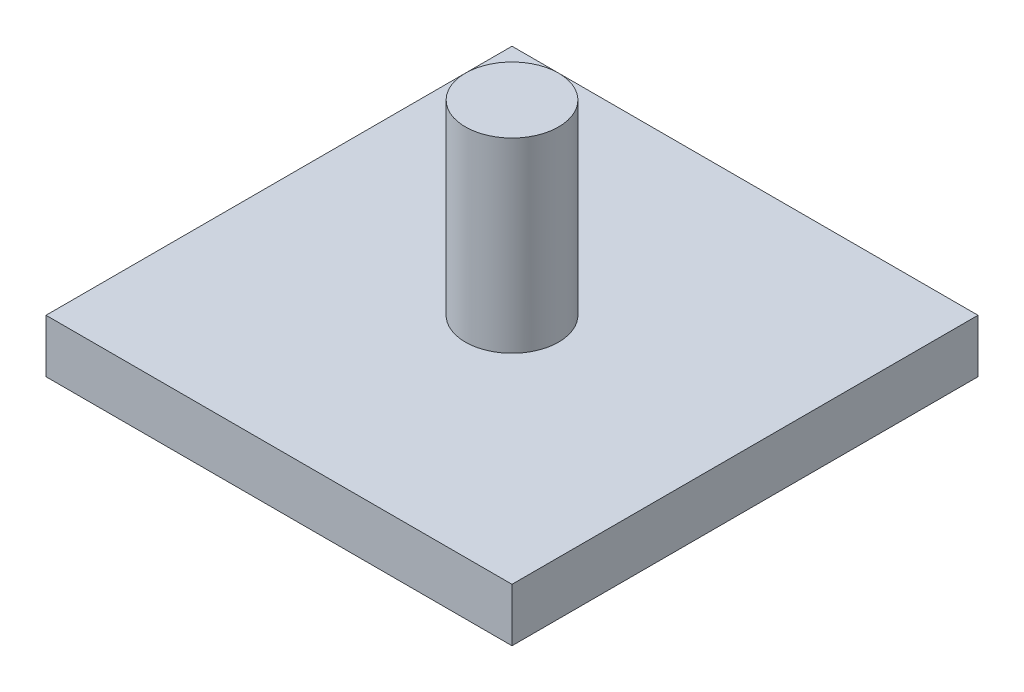
ISO-10303-21;
HEADER;
FILE_DESCRIPTION(('STEP AP214'),'2;1');
FILE_NAME('part.step','',(''),(''),'','','');
FILE_SCHEMA(('AUTOMOTIVE_DESIGN { 1 0 10303 214 1 1 1 1 }'));
ENDSEC;
DATA;
#1=APPLICATION_CONTEXT('core data for automotive mechanical design processes');
#2=APPLICATION_PROTOCOL_DEFINITION('international standard','automotive_design',2000,#1);
#3=PRODUCT_CONTEXT('',#1,'mechanical');
#4=PRODUCT('Part','Part','',(#3));
#5=PRODUCT_RELATED_PRODUCT_CATEGORY('part','',(#4));
#6=PRODUCT_DEFINITION_FORMATION('','',#4);
#7=PRODUCT_DEFINITION_CONTEXT('part definition',#1,'design');
#8=PRODUCT_DEFINITION('design','',#6,#7);
#9=PRODUCT_DEFINITION_SHAPE('','',#8);
#10=(LENGTH_UNIT() NAMED_UNIT(*) SI_UNIT(.MILLI.,.METRE.));
#11=(NAMED_UNIT(*) PLANE_ANGLE_UNIT() SI_UNIT($,.RADIAN.));
#12=(NAMED_UNIT(*) SI_UNIT($,.STERADIAN.) SOLID_ANGLE_UNIT());
#13=UNCERTAINTY_MEASURE_WITH_UNIT(LENGTH_MEASURE(1.E-05),#10,'distance_accuracy_value','');
#14=(GEOMETRIC_REPRESENTATION_CONTEXT(3) GLOBAL_UNCERTAINTY_ASSIGNED_CONTEXT((#13)) GLOBAL_UNIT_ASSIGNED_CONTEXT((#10,
#11,#12)) REPRESENTATION_CONTEXT('',''));
#15=CARTESIAN_POINT('',(0.,0.,0.));
#16=DIRECTION('',(0.,0.,1.));
#17=DIRECTION('',(1.,0.,0.));
#18=AXIS2_PLACEMENT_3D('',#15,#16,#17);
#19=CARTESIAN_POINT('',(35.,8.,-35.));
#20=DIRECTION('',(-1.,0.,0.));
#21=DIRECTION('',(0.,0.,1.));
#22=AXIS2_PLACEMENT_3D('',#19,#20,#21);
#23=PLANE('',#22);
#24=DIRECTION('',(0.,0.,-1.));
#25=VECTOR('',#24,1.);
#26=CARTESIAN_POINT('',(35.,0.,-35.));
#27=LINE('',#26,#25);
#28=CARTESIAN_POINT('',(35.,0.,35.));
#29=VERTEX_POINT('',#28);
#30=CARTESIAN_POINT('',(35.,0.,-35.));
#31=VERTEX_POINT('',#30);
#32=EDGE_CURVE('E100',#29,#31,#27,.T.);
#33=ORIENTED_EDGE('',*,*,#32,.T.);
#34=DIRECTION('',(0.,-1.,0.));
#35=VECTOR('',#34,1.);
#36=CARTESIAN_POINT('',(35.,8.,-35.));
#37=LINE('',#36,#35);
#38=CARTESIAN_POINT('',(35.,8.,-35.));
#39=VERTEX_POINT('',#38);
#40=EDGE_CURVE('E11',#39,#31,#37,.T.);
#41=ORIENTED_EDGE('',*,*,#40,.F.);
#42=DIRECTION('',(0.,0.,-1.));
#43=VECTOR('',#42,1.);
#44=CARTESIAN_POINT('',(35.,8.,-35.));
#45=LINE('',#44,#43);
#46=CARTESIAN_POINT('',(35.,8.,35.));
#47=VERTEX_POINT('',#46);
#48=EDGE_CURVE('E88',#47,#39,#45,.T.);
#49=ORIENTED_EDGE('',*,*,#48,.F.);
#50=DIRECTION('',(0.,-1.,0.));
#51=VECTOR('',#50,1.);
#52=CARTESIAN_POINT('',(35.,8.,35.));
#53=LINE('',#52,#51);
#54=EDGE_CURVE('E96',#47,#29,#53,.T.);
#55=ORIENTED_EDGE('',*,*,#54,.T.);
#56=EDGE_LOOP('',(#33,#41,#49,#55));
#57=FACE_BOUND('',#56,.T.);
#58=ADVANCED_FACE('F37',(#57),#23,.F.);
#59=CARTESIAN_POINT('',(-35.,8.,-35.));
#60=DIRECTION('',(0.,0.,1.));
#61=DIRECTION('',(1.,0.,0.));
#62=AXIS2_PLACEMENT_3D('',#59,#60,#61);
#63=PLANE('',#62);
#64=DIRECTION('',(-1.,0.,0.));
#65=VECTOR('',#64,1.);
#66=CARTESIAN_POINT('',(-35.,0.,-35.));
#67=LINE('',#66,#65);
#68=CARTESIAN_POINT('',(-35.,0.,-35.));
#69=VERTEX_POINT('',#68);
#70=EDGE_CURVE('E92',#31,#69,#67,.T.);
#71=ORIENTED_EDGE('',*,*,#70,.T.);
#72=DIRECTION('',(0.,-1.,0.));
#73=VECTOR('',#72,1.);
#74=CARTESIAN_POINT('',(-35.,8.,-35.));
#75=LINE('',#74,#73);
#76=CARTESIAN_POINT('',(-35.,8.,-35.));
#77=VERTEX_POINT('',#76);
#78=EDGE_CURVE('E45',#77,#69,#75,.T.);
#79=ORIENTED_EDGE('',*,*,#78,.F.);
#80=DIRECTION('',(-1.,0.,0.));
#81=VECTOR('',#80,1.);
#82=CARTESIAN_POINT('',(-35.,8.,-35.));
#83=LINE('',#82,#81);
#84=EDGE_CURVE('E83',#39,#77,#83,.T.);
#85=ORIENTED_EDGE('',*,*,#84,.F.);
#86=ORIENTED_EDGE('',*,*,#40,.T.);
#87=EDGE_LOOP('',(#71,#79,#85,#86));
#88=FACE_BOUND('',#87,.T.);
#89=ADVANCED_FACE('F91',(#88),#63,.F.);
#90=CARTESIAN_POINT('',(-35.,8.,-35.));
#91=DIRECTION('',(1.,0.,0.));
#92=DIRECTION('',(0.,0.,-1.));
#93=AXIS2_PLACEMENT_3D('',#90,#91,#92);
#94=PLANE('',#93);
#95=DIRECTION('',(0.,0.,1.));
#96=VECTOR('',#95,1.);
#97=CARTESIAN_POINT('',(-35.,0.,-35.));
#98=LINE('',#97,#96);
#99=CARTESIAN_POINT('',(-35.,0.,35.));
#100=VERTEX_POINT('',#99);
#101=EDGE_CURVE('E70',#69,#100,#98,.T.);
#102=ORIENTED_EDGE('',*,*,#101,.T.);
#103=DIRECTION('',(0.,-1.,0.));
#104=VECTOR('',#103,1.);
#105=CARTESIAN_POINT('',(-35.,8.,35.));
#106=LINE('',#105,#104);
#107=CARTESIAN_POINT('',(-35.,8.,35.));
#108=VERTEX_POINT('',#107);
#109=EDGE_CURVE('E93',#108,#100,#106,.T.);
#110=ORIENTED_EDGE('',*,*,#109,.F.);
#111=DIRECTION('',(0.,0.,1.));
#112=VECTOR('',#111,1.);
#113=CARTESIAN_POINT('',(-35.,8.,-35.));
#114=LINE('',#113,#112);
#115=EDGE_CURVE('E86',#77,#108,#114,.T.);
#116=ORIENTED_EDGE('',*,*,#115,.F.);
#117=ORIENTED_EDGE('',*,*,#78,.T.);
#118=EDGE_LOOP('',(#102,#110,#116,#117));
#119=FACE_BOUND('',#118,.T.);
#120=ADVANCED_FACE('F94',(#119),#94,.F.);
#121=CARTESIAN_POINT('',(-35.,8.,35.));
#122=DIRECTION('',(0.,0.,-1.));
#123=DIRECTION('',(-1.,0.,0.));
#124=AXIS2_PLACEMENT_3D('',#121,#122,#123);
#125=PLANE('',#124);
#126=DIRECTION('',(1.,0.,0.));
#127=VECTOR('',#126,1.);
#128=CARTESIAN_POINT('',(-35.,0.,35.));
#129=LINE('',#128,#127);
#130=EDGE_CURVE('E76',#100,#29,#129,.T.);
#131=ORIENTED_EDGE('',*,*,#130,.T.);
#132=ORIENTED_EDGE('',*,*,#54,.F.);
#133=DIRECTION('',(1.,0.,0.));
#134=VECTOR('',#133,1.);
#135=CARTESIAN_POINT('',(-35.,8.,35.));
#136=LINE('',#135,#134);
#137=EDGE_CURVE('E53',#108,#47,#136,.T.);
#138=ORIENTED_EDGE('',*,*,#137,.F.);
#139=ORIENTED_EDGE('',*,*,#109,.T.);
#140=EDGE_LOOP('',(#131,#132,#138,#139));
#141=FACE_BOUND('',#140,.T.);
#142=ADVANCED_FACE('F108',(#141),#125,.F.);
#143=CARTESIAN_POINT('',(0.,8.,0.));
#144=DIRECTION('',(0.,1.,0.));
#145=DIRECTION('',(0.,0.,1.));
#146=AXIS2_PLACEMENT_3D('',#143,#144,#145);
#147=PLANE('',#146);
#148=CARTESIAN_POINT('',(0.,8.,0.));
#149=DIRECTION('',(0.,1.,0.));
#150=DIRECTION('',(0.,0.,1.));
#151=AXIS2_PLACEMENT_3D('',#148,#149,#150);
#152=CIRCLE('',#151,7.);
#153=CARTESIAN_POINT('',(0.,8.,7.));
#154=VERTEX_POINT('',#153);
#155=EDGE_CURVE('E103',#154,#154,#152,.F.);
#156=ORIENTED_EDGE('',*,*,#155,.T.);
#157=EDGE_LOOP('',(#156));
#158=FACE_BOUND('',#157,.T.);
#159=ORIENTED_EDGE('',*,*,#48,.T.);
#160=ORIENTED_EDGE('',*,*,#84,.T.);
#161=ORIENTED_EDGE('',*,*,#115,.T.);
#162=ORIENTED_EDGE('',*,*,#137,.T.);
#163=EDGE_LOOP('',(#159,#160,#161,#162));
#164=FACE_BOUND('',#163,.T.);
#165=ADVANCED_FACE('F84',(#158,#164),#147,.T.);
#166=CARTESIAN_POINT('',(0.,0.,0.));
#167=DIRECTION('',(0.,1.,0.));
#168=DIRECTION('',(0.,0.,1.));
#169=AXIS2_PLACEMENT_3D('',#166,#167,#168);
#170=PLANE('',#169);
#171=ORIENTED_EDGE('',*,*,#32,.F.);
#172=ORIENTED_EDGE('',*,*,#130,.F.);
#173=ORIENTED_EDGE('',*,*,#101,.F.);
#174=ORIENTED_EDGE('',*,*,#70,.F.);
#175=EDGE_LOOP('',(#171,#172,#173,#174));
#176=FACE_BOUND('',#175,.T.);
#177=ADVANCED_FACE('F111',(#176),#170,.F.);
#178=CARTESIAN_POINT('',(0.,-7.26328682818989,0.));
#179=DIRECTION('',(0.,-1.,0.));
#180=DIRECTION('',(0.,0.,-1.));
#181=AXIS2_PLACEMENT_3D('',#178,#179,#180);
#182=CYLINDRICAL_SURFACE('',#181,7.);
#183=ORIENTED_EDGE('',*,*,#155,.F.);
#184=EDGE_LOOP('',(#183));
#185=FACE_BOUND('',#184,.T.);
#186=CARTESIAN_POINT('',(0.,36.,0.));
#187=DIRECTION('',(0.,-1.,0.));
#188=DIRECTION('',(0.,0.,-1.));
#189=AXIS2_PLACEMENT_3D('',#186,#187,#188);
#190=CIRCLE('',#189,7.);
#191=CARTESIAN_POINT('',(0.,36.,-7.));
#192=VERTEX_POINT('',#191);
#193=EDGE_CURVE('E116',#192,#192,#190,.T.);
#194=ORIENTED_EDGE('',*,*,#193,.T.);
#195=EDGE_LOOP('',(#194));
#196=FACE_BOUND('',#195,.T.);
#197=ADVANCED_FACE('F120',(#185,#196),#182,.T.);
#198=CARTESIAN_POINT('',(-7.,36.,0.));
#199=DIRECTION('',(0.,-1.,0.));
#200=DIRECTION('',(0.,0.,-1.));
#201=AXIS2_PLACEMENT_3D('',#198,#199,#200);
#202=PLANE('',#201);
#203=ORIENTED_EDGE('',*,*,#193,.F.);
#204=EDGE_LOOP('',(#203));
#205=FACE_BOUND('',#204,.T.);
#206=ADVANCED_FACE('F122',(#205),#202,.F.);
#207=CLOSED_SHELL('',(#58,#89,#120,#142,#165,#177,#197,#206));
#208=MANIFOLD_SOLID_BREP('B2',#207);
#209=ADVANCED_BREP_SHAPE_REPRESENTATION('',(#18,#208),#14);
#210=SHAPE_DEFINITION_REPRESENTATION(#9,#209);
ENDSEC;
END-ISO-10303-21;
